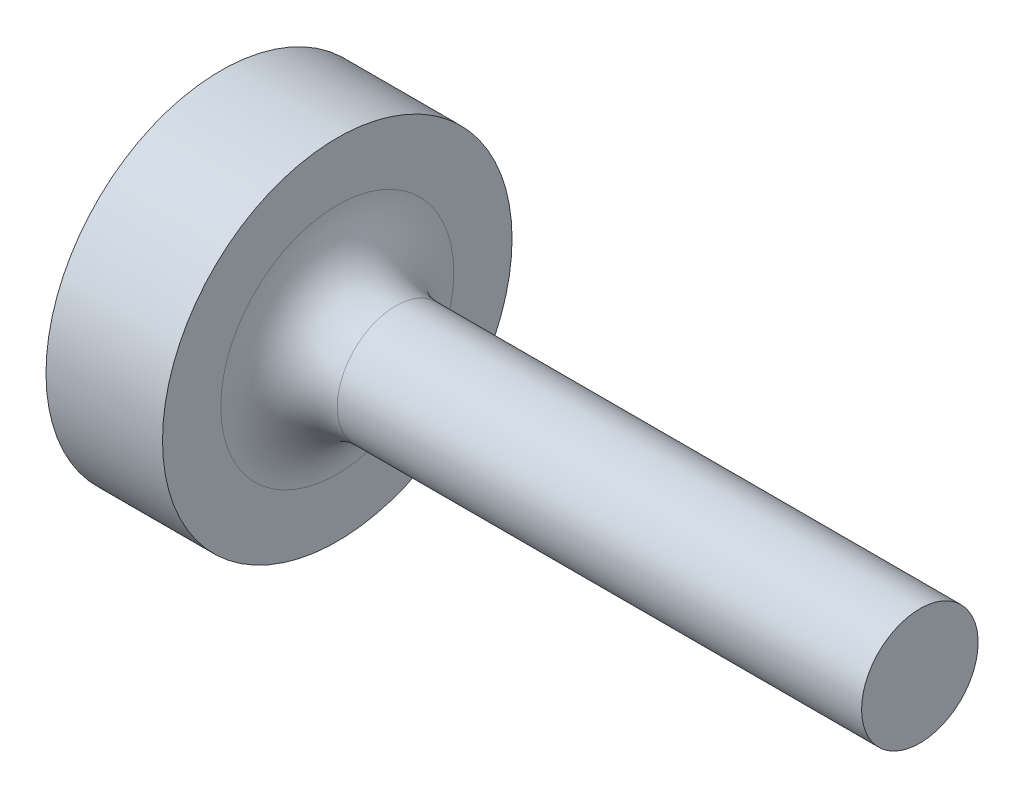
ISO-10303-21;
HEADER;
FILE_DESCRIPTION(('STEP AP214'),'2;1');
FILE_NAME('part.step','',(''),(''),'','','');
FILE_SCHEMA(('AUTOMOTIVE_DESIGN { 1 0 10303 214 1 1 1 1 }'));
ENDSEC;
DATA;
#1=APPLICATION_CONTEXT('core data for automotive mechanical design processes');
#2=APPLICATION_PROTOCOL_DEFINITION('international standard','automotive_design',2000,#1);
#3=PRODUCT_CONTEXT('',#1,'mechanical');
#4=PRODUCT('Part','Part','',(#3));
#5=PRODUCT_RELATED_PRODUCT_CATEGORY('part','',(#4));
#6=PRODUCT_DEFINITION_FORMATION('','',#4);
#7=PRODUCT_DEFINITION_CONTEXT('part definition',#1,'design');
#8=PRODUCT_DEFINITION('design','',#6,#7);
#9=PRODUCT_DEFINITION_SHAPE('','',#8);
#10=(LENGTH_UNIT() NAMED_UNIT(*) SI_UNIT(.MILLI.,.METRE.));
#11=(NAMED_UNIT(*) PLANE_ANGLE_UNIT() SI_UNIT($,.RADIAN.));
#12=(NAMED_UNIT(*) SI_UNIT($,.STERADIAN.) SOLID_ANGLE_UNIT());
#13=UNCERTAINTY_MEASURE_WITH_UNIT(LENGTH_MEASURE(1.E-05),#10,'distance_accuracy_value','');
#14=(GEOMETRIC_REPRESENTATION_CONTEXT(3) GLOBAL_UNCERTAINTY_ASSIGNED_CONTEXT((#13)) GLOBAL_UNIT_ASSIGNED_CONTEXT((#10,
#11,#12)) REPRESENTATION_CONTEXT('',''));
#15=CARTESIAN_POINT('',(0.,0.,0.));
#16=DIRECTION('',(0.,0.,1.));
#17=DIRECTION('',(1.,0.,0.));
#18=AXIS2_PLACEMENT_3D('',#15,#16,#17);
#19=CARTESIAN_POINT('',(10.,0.,0.));
#20=DIRECTION('',(-1.,0.,0.));
#21=DIRECTION('',(0.,0.,1.));
#22=AXIS2_PLACEMENT_3D('',#19,#20,#21);
#23=PLANE('',#22);
#24=CARTESIAN_POINT('',(10.,0.,0.));
#25=DIRECTION('',(-1.,0.,0.));
#26=DIRECTION('',(0.,0.,1.));
#27=AXIS2_PLACEMENT_3D('',#24,#25,#26);
#28=CIRCLE('',#27,1.);
#29=CARTESIAN_POINT('',(10.,0.,1.));
#30=VERTEX_POINT('',#29);
#31=EDGE_CURVE('E60',#30,#30,#28,.T.);
#32=ORIENTED_EDGE('',*,*,#31,.F.);
#33=EDGE_LOOP('',(#32));
#34=FACE_BOUND('',#33,.T.);
#35=ADVANCED_FACE('F37',(#34),#23,.F.);
#36=CARTESIAN_POINT('',(-2.,3.,0.));
#37=DIRECTION('',(1.,0.,0.));
#38=DIRECTION('',(0.,0.,-1.));
#39=AXIS2_PLACEMENT_3D('',#36,#37,#38);
#40=PLANE('',#39);
#41=CARTESIAN_POINT('',(-2.,0.,0.));
#42=DIRECTION('',(-1.,0.,0.));
#43=DIRECTION('',(0.,0.,1.));
#44=AXIS2_PLACEMENT_3D('',#41,#42,#43);
#45=CIRCLE('',#44,3.);
#46=CARTESIAN_POINT('',(-2.,0.,3.));
#47=VERTEX_POINT('',#46);
#48=EDGE_CURVE('E10',#47,#47,#45,.T.);
#49=ORIENTED_EDGE('',*,*,#48,.T.);
#50=EDGE_LOOP('',(#49));
#51=FACE_BOUND('',#50,.T.);
#52=ADVANCED_FACE('F68',(#51),#40,.F.);
#53=CARTESIAN_POINT('',(-2.,0.,0.));
#54=DIRECTION('',(-1.,0.,0.));
#55=DIRECTION('',(0.,0.,1.));
#56=AXIS2_PLACEMENT_3D('',#53,#54,#55);
#57=CYLINDRICAL_SURFACE('',#56,3.);
#58=ORIENTED_EDGE('',*,*,#48,.F.);
#59=EDGE_LOOP('',(#58));
#60=FACE_BOUND('',#59,.T.);
#61=CARTESIAN_POINT('',(0.,0.,0.));
#62=DIRECTION('',(-1.,0.,0.));
#63=DIRECTION('',(0.,0.,1.));
#64=AXIS2_PLACEMENT_3D('',#61,#62,#63);
#65=CIRCLE('',#64,3.);
#66=CARTESIAN_POINT('',(0.,0.,3.));
#67=VERTEX_POINT('',#66);
#68=EDGE_CURVE('E44',#67,#67,#65,.T.);
#69=ORIENTED_EDGE('',*,*,#68,.T.);
#70=EDGE_LOOP('',(#69));
#71=FACE_BOUND('',#70,.T.);
#72=ADVANCED_FACE('F72',(#60,#71),#57,.T.);
#73=CARTESIAN_POINT('',(0.,2.00000000000001,0.));
#74=DIRECTION('',(-1.,0.,0.));
#75=DIRECTION('',(0.,0.,1.));
#76=AXIS2_PLACEMENT_3D('',#73,#74,#75);
#77=PLANE('',#76);
#78=ORIENTED_EDGE('',*,*,#68,.F.);
#79=EDGE_LOOP('',(#78));
#80=FACE_BOUND('',#79,.T.);
#81=CARTESIAN_POINT('',(0.,0.,0.));
#82=DIRECTION('',(-1.,0.,0.));
#83=DIRECTION('',(0.,0.,1.));
#84=AXIS2_PLACEMENT_3D('',#81,#82,#83);
#85=CIRCLE('',#84,2.00000000000001);
#86=CARTESIAN_POINT('',(0.,0.,2.00000000000001));
#87=VERTEX_POINT('',#86);
#88=EDGE_CURVE('E49',#87,#87,#85,.T.);
#89=ORIENTED_EDGE('',*,*,#88,.T.);
#90=EDGE_LOOP('',(#89));
#91=FACE_BOUND('',#90,.T.);
#92=ADVANCED_FACE('F76',(#80,#91),#77,.F.);
#93=CARTESIAN_POINT('',(1.,0.,0.));
#94=DIRECTION('',(-1.,0.,0.));
#95=DIRECTION('',(0.,0.,1.));
#96=AXIS2_PLACEMENT_3D('',#93,#94,#95);
#97=TOROIDAL_SURFACE('',#96,2.,1.);
#98=ORIENTED_EDGE('',*,*,#88,.F.);
#99=EDGE_LOOP('',(#98));
#100=FACE_BOUND('',#99,.T.);
#101=CARTESIAN_POINT('',(1.00000000000001,0.,0.));
#102=DIRECTION('',(-1.,0.,0.));
#103=DIRECTION('',(0.,0.,1.));
#104=AXIS2_PLACEMENT_3D('',#101,#102,#103);
#105=CIRCLE('',#104,1.);
#106=CARTESIAN_POINT('',(1.00000000000001,0.,1.));
#107=VERTEX_POINT('',#106);
#108=EDGE_CURVE('E54',#107,#107,#105,.T.);
#109=ORIENTED_EDGE('',*,*,#108,.T.);
#110=EDGE_LOOP('',(#109));
#111=FACE_BOUND('',#110,.T.);
#112=ADVANCED_FACE('F82',(#100,#111),#97,.F.);
#113=CARTESIAN_POINT('',(-2.,0.,0.));
#114=DIRECTION('',(-1.,0.,0.));
#115=DIRECTION('',(0.,0.,1.));
#116=AXIS2_PLACEMENT_3D('',#113,#114,#115);
#117=CYLINDRICAL_SURFACE('',#116,1.);
#118=ORIENTED_EDGE('',*,*,#108,.F.);
#119=EDGE_LOOP('',(#118));
#120=FACE_BOUND('',#119,.T.);
#121=ORIENTED_EDGE('',*,*,#31,.T.);
#122=EDGE_LOOP('',(#121));
#123=FACE_BOUND('',#122,.T.);
#124=ADVANCED_FACE('F65',(#120,#123),#117,.T.);
#125=CLOSED_SHELL('',(#35,#52,#72,#92,#112,#124));
#126=MANIFOLD_SOLID_BREP('B2',#125);
#127=ADVANCED_BREP_SHAPE_REPRESENTATION('',(#18,#126),#14);
#128=SHAPE_DEFINITION_REPRESENTATION(#9,#127);
ENDSEC;
END-ISO-10303-21;
